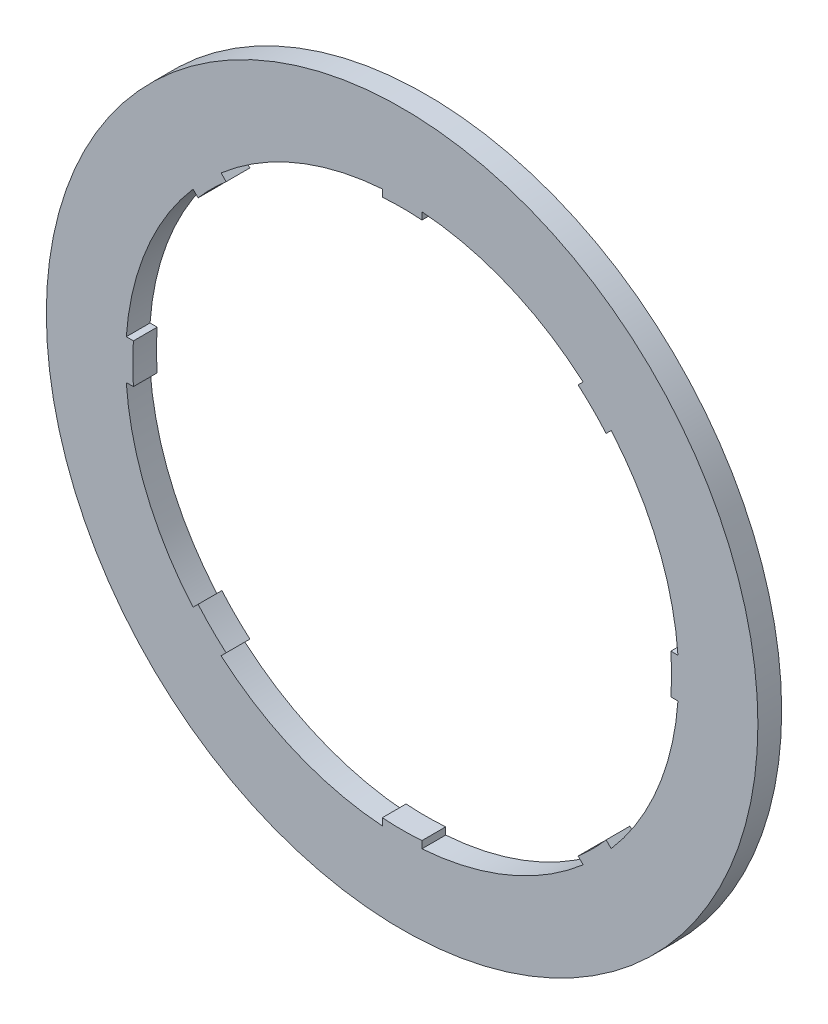
ISO-10303-21;
HEADER;
FILE_DESCRIPTION(('STEP AP214'),'2;1');
FILE_NAME('part.step','',(''),(''),'','','');
FILE_SCHEMA(('AUTOMOTIVE_DESIGN { 1 0 10303 214 1 1 1 1 }'));
ENDSEC;
DATA;
#1=APPLICATION_CONTEXT('core data for automotive mechanical design processes');
#2=APPLICATION_PROTOCOL_DEFINITION('international standard','automotive_design',2000,#1);
#3=PRODUCT_CONTEXT('',#1,'mechanical');
#4=PRODUCT('Part','Part','',(#3));
#5=PRODUCT_RELATED_PRODUCT_CATEGORY('part','',(#4));
#6=PRODUCT_DEFINITION_FORMATION('','',#4);
#7=PRODUCT_DEFINITION_CONTEXT('part definition',#1,'design');
#8=PRODUCT_DEFINITION('design','',#6,#7);
#9=PRODUCT_DEFINITION_SHAPE('','',#8);
#10=(LENGTH_UNIT() NAMED_UNIT(*) SI_UNIT(.MILLI.,.METRE.));
#11=(NAMED_UNIT(*) PLANE_ANGLE_UNIT() SI_UNIT($,.RADIAN.));
#12=(NAMED_UNIT(*) SI_UNIT($,.STERADIAN.) SOLID_ANGLE_UNIT());
#13=UNCERTAINTY_MEASURE_WITH_UNIT(LENGTH_MEASURE(1.E-05),#10,'distance_accuracy_value','');
#14=(GEOMETRIC_REPRESENTATION_CONTEXT(3) GLOBAL_UNCERTAINTY_ASSIGNED_CONTEXT((#13)) GLOBAL_UNIT_ASSIGNED_CONTEXT((#10,
#11,#12)) REPRESENTATION_CONTEXT('',''));
#15=CARTESIAN_POINT('',(0.,0.,0.));
#16=DIRECTION('',(0.,0.,1.));
#17=DIRECTION('',(1.,0.,0.));
#18=AXIS2_PLACEMENT_3D('',#15,#16,#17);
#19=CARTESIAN_POINT('',(0.,0.,3.));
#20=DIRECTION('',(0.,0.,1.));
#21=DIRECTION('',(1.,0.,0.));
#22=AXIS2_PLACEMENT_3D('',#19,#20,#21);
#23=PLANE('',#22);
#24=CARTESIAN_POINT('',(0.,0.,3.));
#25=DIRECTION('',(0.,0.,1.));
#26=DIRECTION('',(1.,0.,0.));
#27=AXIS2_PLACEMENT_3D('',#24,#25,#26);
#28=CIRCLE('',#27,44.9);
#29=CARTESIAN_POINT('',(44.9,0.,3.));
#30=VERTEX_POINT('',#29);
#31=EDGE_CURVE('E11',#30,#30,#28,.T.);
#32=ORIENTED_EDGE('',*,*,#31,.T.);
#33=EDGE_LOOP('',(#32));
#34=FACE_BOUND('',#33,.T.);
#35=DIRECTION('',(0.,1.,0.));
#36=VECTOR('',#35,1.);
#37=CARTESIAN_POINT('',(-2.5,33.9079636663719,3.));
#38=LINE('',#37,#36);
#39=CARTESIAN_POINT('',(-2.5,33.9079636663719,3.));
#40=VERTEX_POINT('',#39);
#41=CARTESIAN_POINT('',(-2.5,34.8103432904647,3.));
#42=VERTEX_POINT('',#41);
#43=EDGE_CURVE('E258',#40,#42,#38,.T.);
#44=ORIENTED_EDGE('',*,*,#43,.F.);
#45=CARTESIAN_POINT('',(0.,0.,3.));
#46=DIRECTION('',(0.,0.,1.));
#47=DIRECTION('',(1.,0.,0.));
#48=AXIS2_PLACEMENT_3D('',#45,#46,#47);
#49=CIRCLE('',#48,34.);
#50=CARTESIAN_POINT('',(2.5,33.9079636663719,3.));
#51=VERTEX_POINT('',#50);
#52=EDGE_CURVE('E250',#51,#40,#49,.T.);
#53=ORIENTED_EDGE('',*,*,#52,.F.);
#54=DIRECTION('',(0.,-1.,0.));
#55=VECTOR('',#54,1.);
#56=CARTESIAN_POINT('',(2.5,33.9079636663719,3.));
#57=LINE('',#56,#55);
#58=CARTESIAN_POINT('',(2.5,34.8103432904647,3.));
#59=VERTEX_POINT('',#58);
#60=EDGE_CURVE('E330',#59,#51,#57,.T.);
#61=ORIENTED_EDGE('',*,*,#60,.F.);
#62=CARTESIAN_POINT('',(0.,0.,3.));
#63=DIRECTION('',(0.,0.,1.));
#64=DIRECTION('',(1.,0.,0.));
#65=AXIS2_PLACEMENT_3D('',#62,#63,#64);
#66=CIRCLE('',#65,34.9);
#67=CARTESIAN_POINT('',(22.846862843153,26.3823967490855,3.));
#68=VERTEX_POINT('',#67);
#69=EDGE_CURVE('E328',#68,#59,#66,.T.);
#70=ORIENTED_EDGE('',*,*,#69,.F.);
#71=DIRECTION('',(0.707106781186551,0.707106781186544,0.));
#72=VECTOR('',#71,1.);
#73=CARTESIAN_POINT('',(22.846862843153,26.3823967490855,3.));
#74=LINE('',#73,#72);
#75=CARTESIAN_POINT('',(22.2087840917524,25.7443179976849,3.));
#76=VERTEX_POINT('',#75);
#77=EDGE_CURVE('E326',#76,#68,#74,.T.);
#78=ORIENTED_EDGE('',*,*,#77,.F.);
#79=CARTESIAN_POINT('',(0.,0.,3.));
#80=DIRECTION('',(0.,0.,1.));
#81=DIRECTION('',(1.,0.,0.));
#82=AXIS2_PLACEMENT_3D('',#79,#80,#81);
#83=CIRCLE('',#82,34.);
#84=CARTESIAN_POINT('',(25.7443179976852,22.2087840917522,3.));
#85=VERTEX_POINT('',#84);
#86=EDGE_CURVE('E324',#85,#76,#83,.T.);
#87=ORIENTED_EDGE('',*,*,#86,.F.);
#88=DIRECTION('',(-0.707106781186555,-0.70710678118654,0.));
#89=VECTOR('',#88,1.);
#90=CARTESIAN_POINT('',(26.3823967490857,22.8468628431527,3.));
#91=LINE('',#90,#89);
#92=CARTESIAN_POINT('',(26.3823967490857,22.8468628431527,3.));
#93=VERTEX_POINT('',#92);
#94=EDGE_CURVE('E322',#93,#85,#91,.T.);
#95=ORIENTED_EDGE('',*,*,#94,.F.);
#96=CARTESIAN_POINT('',(0.,0.,3.));
#97=DIRECTION('',(0.,0.,1.));
#98=DIRECTION('',(1.,0.,0.));
#99=AXIS2_PLACEMENT_3D('',#96,#97,#98);
#100=CIRCLE('',#99,34.9);
#101=CARTESIAN_POINT('',(34.8103432904647,2.50000000000001,3.));
#102=VERTEX_POINT('',#101);
#103=EDGE_CURVE('E320',#102,#93,#100,.T.);
#104=ORIENTED_EDGE('',*,*,#103,.F.);
#105=DIRECTION('',(1.,0.,0.));
#106=VECTOR('',#105,1.);
#107=CARTESIAN_POINT('',(34.8103432904647,2.50000000000001,3.));
#108=LINE('',#107,#106);
#109=CARTESIAN_POINT('',(33.907963666372,2.50000000000002,3.));
#110=VERTEX_POINT('',#109);
#111=EDGE_CURVE('E318',#110,#102,#108,.T.);
#112=ORIENTED_EDGE('',*,*,#111,.F.);
#113=CARTESIAN_POINT('',(0.,0.,3.));
#114=DIRECTION('',(0.,0.,1.));
#115=DIRECTION('',(1.,0.,0.));
#116=AXIS2_PLACEMENT_3D('',#113,#114,#115);
#117=CIRCLE('',#116,34.);
#118=CARTESIAN_POINT('',(33.907963666372,-2.49999999999999,3.));
#119=VERTEX_POINT('',#118);
#120=EDGE_CURVE('E316',#119,#110,#117,.T.);
#121=ORIENTED_EDGE('',*,*,#120,.F.);
#122=DIRECTION('',(-1.,0.,0.));
#123=VECTOR('',#122,1.);
#124=CARTESIAN_POINT('',(33.907963666372,-2.49999999999999,3.));
#125=LINE('',#124,#123);
#126=CARTESIAN_POINT('',(34.8103432904647,-2.5,3.));
#127=VERTEX_POINT('',#126);
#128=EDGE_CURVE('E314',#127,#119,#125,.T.);
#129=ORIENTED_EDGE('',*,*,#128,.F.);
#130=CARTESIAN_POINT('',(0.,0.,3.));
#131=DIRECTION('',(0.,0.,1.));
#132=DIRECTION('',(1.,0.,0.));
#133=AXIS2_PLACEMENT_3D('',#130,#131,#132);
#134=CIRCLE('',#133,34.9);
#135=CARTESIAN_POINT('',(26.3823967490852,-22.8468628431533,3.));
#136=VERTEX_POINT('',#135);
#137=EDGE_CURVE('E312',#136,#127,#134,.T.);
#138=ORIENTED_EDGE('',*,*,#137,.F.);
#139=DIRECTION('',(0.707106781186536,-0.707106781186559,0.));
#140=VECTOR('',#139,1.);
#141=CARTESIAN_POINT('',(26.3823967490852,-22.8468628431533,3.));
#142=LINE('',#141,#140);
#143=CARTESIAN_POINT('',(25.7443179976847,-22.2087840917527,3.));
#144=VERTEX_POINT('',#143);
#145=EDGE_CURVE('E310',#144,#136,#142,.T.);
#146=ORIENTED_EDGE('',*,*,#145,.F.);
#147=CARTESIAN_POINT('',(0.,0.,3.));
#148=DIRECTION('',(0.,0.,1.));
#149=DIRECTION('',(1.,0.,0.));
#150=AXIS2_PLACEMENT_3D('',#147,#148,#149);
#151=CIRCLE('',#150,34.);
#152=CARTESIAN_POINT('',(22.2087840917519,-25.7443179976854,3.));
#153=VERTEX_POINT('',#152);
#154=EDGE_CURVE('E308',#153,#144,#151,.T.);
#155=ORIENTED_EDGE('',*,*,#154,.F.);
#156=DIRECTION('',(-0.707106781186538,0.707106781186557,0.));
#157=VECTOR('',#156,1.);
#158=CARTESIAN_POINT('',(22.8468628431524,-26.3823967490859,3.));
#159=LINE('',#158,#157);
#160=CARTESIAN_POINT('',(22.8468628431524,-26.382396749086,3.));
#161=VERTEX_POINT('',#160);
#162=EDGE_CURVE('E306',#161,#153,#159,.T.);
#163=ORIENTED_EDGE('',*,*,#162,.F.);
#164=CARTESIAN_POINT('',(0.,0.,3.));
#165=DIRECTION('',(0.,0.,1.));
#166=DIRECTION('',(1.,0.,0.));
#167=AXIS2_PLACEMENT_3D('',#164,#165,#166);
#168=CIRCLE('',#167,34.9);
#169=CARTESIAN_POINT('',(2.5,-34.8103432904647,3.));
#170=VERTEX_POINT('',#169);
#171=EDGE_CURVE('E304',#170,#161,#168,.T.);
#172=ORIENTED_EDGE('',*,*,#171,.F.);
#173=DIRECTION('',(0.,-1.,0.));
#174=VECTOR('',#173,1.);
#175=CARTESIAN_POINT('',(2.5,-33.9079636663719,3.));
#176=LINE('',#175,#174);
#177=CARTESIAN_POINT('',(2.50000000000001,-33.9079636663719,3.));
#178=VERTEX_POINT('',#177);
#179=EDGE_CURVE('E302',#178,#170,#176,.T.);
#180=ORIENTED_EDGE('',*,*,#179,.F.);
#181=CARTESIAN_POINT('',(0.,0.,3.));
#182=DIRECTION('',(0.,0.,1.));
#183=DIRECTION('',(1.,0.,0.));
#184=AXIS2_PLACEMENT_3D('',#181,#182,#183);
#185=CIRCLE('',#184,34.);
#186=CARTESIAN_POINT('',(-2.5,-33.9079636663719,3.));
#187=VERTEX_POINT('',#186);
#188=EDGE_CURVE('E300',#187,#178,#185,.T.);
#189=ORIENTED_EDGE('',*,*,#188,.F.);
#190=DIRECTION('',(0.,1.,0.));
#191=VECTOR('',#190,1.);
#192=CARTESIAN_POINT('',(-2.5,-33.9079636663719,3.));
#193=LINE('',#192,#191);
#194=CARTESIAN_POINT('',(-2.5,-34.8103432904647,3.));
#195=VERTEX_POINT('',#194);
#196=EDGE_CURVE('E298',#195,#187,#193,.T.);
#197=ORIENTED_EDGE('',*,*,#196,.F.);
#198=CARTESIAN_POINT('',(0.,0.,3.));
#199=DIRECTION('',(0.,0.,1.));
#200=DIRECTION('',(1.,0.,0.));
#201=AXIS2_PLACEMENT_3D('',#198,#199,#200);
#202=CIRCLE('',#201,34.9);
#203=CARTESIAN_POINT('',(-22.8468628431524,-26.382396749086,3.));
#204=VERTEX_POINT('',#203);
#205=EDGE_CURVE('E296',#204,#195,#202,.T.);
#206=ORIENTED_EDGE('',*,*,#205,.F.);
#207=DIRECTION('',(-0.707106781186532,-0.707106781186563,0.));
#208=VECTOR('',#207,1.);
#209=CARTESIAN_POINT('',(-22.8468628431524,-26.382396749086,3.));
#210=LINE('',#209,#208);
#211=CARTESIAN_POINT('',(-22.2087840917519,-25.7443179976854,3.));
#212=VERTEX_POINT('',#211);
#213=EDGE_CURVE('E294',#212,#204,#210,.T.);
#214=ORIENTED_EDGE('',*,*,#213,.F.);
#215=CARTESIAN_POINT('',(0.,0.,3.));
#216=DIRECTION('',(0.,0.,1.));
#217=DIRECTION('',(1.,0.,0.));
#218=AXIS2_PLACEMENT_3D('',#215,#216,#217);
#219=CIRCLE('',#218,34.);
#220=CARTESIAN_POINT('',(-25.7443179976847,-22.2087840917527,3.));
#221=VERTEX_POINT('',#220);
#222=EDGE_CURVE('E292',#221,#212,#219,.T.);
#223=ORIENTED_EDGE('',*,*,#222,.F.);
#224=DIRECTION('',(0.707106781186536,0.707106781186559,0.));
#225=VECTOR('',#224,1.);
#226=CARTESIAN_POINT('',(-26.3823967490852,-22.8468628431533,3.));
#227=LINE('',#226,#225);
#228=CARTESIAN_POINT('',(-26.3823967490852,-22.8468628431533,3.));
#229=VERTEX_POINT('',#228);
#230=EDGE_CURVE('E290',#229,#221,#227,.T.);
#231=ORIENTED_EDGE('',*,*,#230,.F.);
#232=CARTESIAN_POINT('',(0.,0.,3.));
#233=DIRECTION('',(0.,0.,1.));
#234=DIRECTION('',(1.,0.,0.));
#235=AXIS2_PLACEMENT_3D('',#232,#233,#234);
#236=CIRCLE('',#235,34.9);
#237=CARTESIAN_POINT('',(-34.8103432904647,-2.5,3.));
#238=VERTEX_POINT('',#237);
#239=EDGE_CURVE('E288',#238,#229,#236,.T.);
#240=ORIENTED_EDGE('',*,*,#239,.F.);
#241=DIRECTION('',(-1.,0.,0.));
#242=VECTOR('',#241,1.);
#243=CARTESIAN_POINT('',(-33.9079636663719,-2.5,3.));
#244=LINE('',#243,#242);
#245=CARTESIAN_POINT('',(-33.9079636663719,-2.5,3.));
#246=VERTEX_POINT('',#245);
#247=EDGE_CURVE('E286',#246,#238,#244,.T.);
#248=ORIENTED_EDGE('',*,*,#247,.F.);
#249=CARTESIAN_POINT('',(0.,0.,3.));
#250=DIRECTION('',(0.,0.,1.));
#251=DIRECTION('',(1.,0.,0.));
#252=AXIS2_PLACEMENT_3D('',#249,#250,#251);
#253=CIRCLE('',#252,34.);
#254=CARTESIAN_POINT('',(-33.9079636663719,2.5,3.));
#255=VERTEX_POINT('',#254);
#256=EDGE_CURVE('E284',#255,#246,#253,.T.);
#257=ORIENTED_EDGE('',*,*,#256,.F.);
#258=DIRECTION('',(1.,0.,0.));
#259=VECTOR('',#258,1.);
#260=CARTESIAN_POINT('',(-34.8103432904647,2.5,3.));
#261=LINE('',#260,#259);
#262=CARTESIAN_POINT('',(-34.8103432904647,2.49999999999999,3.));
#263=VERTEX_POINT('',#262);
#264=EDGE_CURVE('E282',#263,#255,#261,.T.);
#265=ORIENTED_EDGE('',*,*,#264,.F.);
#266=CARTESIAN_POINT('',(0.,0.,3.));
#267=DIRECTION('',(0.,0.,1.));
#268=DIRECTION('',(1.,0.,0.));
#269=AXIS2_PLACEMENT_3D('',#266,#267,#268);
#270=CIRCLE('',#269,34.9);
#271=CARTESIAN_POINT('',(-26.3823967490857,22.8468628431527,3.));
#272=VERTEX_POINT('',#271);
#273=EDGE_CURVE('E280',#272,#263,#270,.T.);
#274=ORIENTED_EDGE('',*,*,#273,.F.);
#275=DIRECTION('',(-0.707106781186553,0.707106781186542,0.));
#276=VECTOR('',#275,1.);
#277=CARTESIAN_POINT('',(-26.3823967490857,22.8468628431527,3.));
#278=LINE('',#277,#276);
#279=CARTESIAN_POINT('',(-25.7443179976852,22.2087840917522,3.));
#280=VERTEX_POINT('',#279);
#281=EDGE_CURVE('E278',#280,#272,#278,.T.);
#282=ORIENTED_EDGE('',*,*,#281,.F.);
#283=CARTESIAN_POINT('',(0.,0.,3.));
#284=DIRECTION('',(0.,0.,1.));
#285=DIRECTION('',(1.,0.,0.));
#286=AXIS2_PLACEMENT_3D('',#283,#284,#285);
#287=CIRCLE('',#286,34.);
#288=CARTESIAN_POINT('',(-22.2087840917524,25.7443179976849,3.));
#289=VERTEX_POINT('',#288);
#290=EDGE_CURVE('E276',#289,#280,#287,.T.);
#291=ORIENTED_EDGE('',*,*,#290,.F.);
#292=DIRECTION('',(0.707106781186551,-0.707106781186544,0.));
#293=VECTOR('',#292,1.);
#294=CARTESIAN_POINT('',(-22.846862843153,26.3823967490855,3.));
#295=LINE('',#294,#293);
#296=CARTESIAN_POINT('',(-22.846862843153,26.3823967490855,3.));
#297=VERTEX_POINT('',#296);
#298=EDGE_CURVE('E272',#297,#289,#295,.T.);
#299=ORIENTED_EDGE('',*,*,#298,.F.);
#300=CARTESIAN_POINT('',(0.,0.,3.));
#301=DIRECTION('',(0.,0.,1.));
#302=DIRECTION('',(1.,0.,0.));
#303=AXIS2_PLACEMENT_3D('',#300,#301,#302);
#304=CIRCLE('',#303,34.9);
#305=EDGE_CURVE('E270',#42,#297,#304,.T.);
#306=ORIENTED_EDGE('',*,*,#305,.F.);
#307=EDGE_LOOP('',(#44,#53,#61,#70,#78,#87,#95,#104,#112,#121,#129,#138,#146,#155,#163,#172,
#180,#189,#197,#206,#214,#223,#231,#240,#248,#257,#265,#274,#282,#291,#299,#306));
#308=FACE_BOUND('',#307,.T.);
#309=ADVANCED_FACE('F41',(#34,#308),#23,.T.);
#310=CARTESIAN_POINT('',(0.,0.,0.));
#311=DIRECTION('',(0.,0.,1.));
#312=DIRECTION('',(1.,0.,0.));
#313=AXIS2_PLACEMENT_3D('',#310,#311,#312);
#314=PLANE('',#313);
#315=CARTESIAN_POINT('',(0.,0.,0.));
#316=DIRECTION('',(0.,0.,1.));
#317=DIRECTION('',(1.,0.,0.));
#318=AXIS2_PLACEMENT_3D('',#315,#316,#317);
#319=CIRCLE('',#318,44.9);
#320=CARTESIAN_POINT('',(44.9,0.,0.));
#321=VERTEX_POINT('',#320);
#322=EDGE_CURVE('E45',#321,#321,#319,.T.);
#323=ORIENTED_EDGE('',*,*,#322,.F.);
#324=EDGE_LOOP('',(#323));
#325=FACE_BOUND('',#324,.T.);
#326=CARTESIAN_POINT('',(0.,0.,0.));
#327=DIRECTION('',(0.,0.,1.));
#328=DIRECTION('',(1.,0.,0.));
#329=AXIS2_PLACEMENT_3D('',#326,#327,#328);
#330=CIRCLE('',#329,34.);
#331=CARTESIAN_POINT('',(2.5,33.9079636663719,0.));
#332=VERTEX_POINT('',#331);
#333=CARTESIAN_POINT('',(-2.5,33.9079636663719,0.));
#334=VERTEX_POINT('',#333);
#335=EDGE_CURVE('E64',#332,#334,#330,.T.);
#336=ORIENTED_EDGE('',*,*,#335,.T.);
#337=DIRECTION('',(0.,1.,0.));
#338=VECTOR('',#337,1.);
#339=CARTESIAN_POINT('',(-2.5,33.9079636663719,0.));
#340=LINE('',#339,#338);
#341=CARTESIAN_POINT('',(-2.5,34.8103432904647,0.));
#342=VERTEX_POINT('',#341);
#343=EDGE_CURVE('E265',#334,#342,#340,.T.);
#344=ORIENTED_EDGE('',*,*,#343,.T.);
#345=CARTESIAN_POINT('',(0.,0.,0.));
#346=DIRECTION('',(0.,0.,1.));
#347=DIRECTION('',(1.,0.,0.));
#348=AXIS2_PLACEMENT_3D('',#345,#346,#347);
#349=CIRCLE('',#348,34.9);
#350=CARTESIAN_POINT('',(-22.846862843153,26.3823967490855,0.));
#351=VERTEX_POINT('',#350);
#352=EDGE_CURVE('E334',#342,#351,#349,.T.);
#353=ORIENTED_EDGE('',*,*,#352,.T.);
#354=DIRECTION('',(0.707106781186551,-0.707106781186544,0.));
#355=VECTOR('',#354,1.);
#356=CARTESIAN_POINT('',(-22.846862843153,26.3823967490855,0.));
#357=LINE('',#356,#355);
#358=CARTESIAN_POINT('',(-22.2087840917524,25.7443179976849,0.));
#359=VERTEX_POINT('',#358);
#360=EDGE_CURVE('E337',#351,#359,#357,.T.);
#361=ORIENTED_EDGE('',*,*,#360,.T.);
#362=CARTESIAN_POINT('',(0.,0.,0.));
#363=DIRECTION('',(0.,0.,1.));
#364=DIRECTION('',(1.,0.,0.));
#365=AXIS2_PLACEMENT_3D('',#362,#363,#364);
#366=CIRCLE('',#365,34.);
#367=CARTESIAN_POINT('',(-25.7443179976852,22.2087840917522,0.));
#368=VERTEX_POINT('',#367);
#369=EDGE_CURVE('E340',#359,#368,#366,.T.);
#370=ORIENTED_EDGE('',*,*,#369,.T.);
#371=DIRECTION('',(-0.707106781186553,0.707106781186542,0.));
#372=VECTOR('',#371,1.);
#373=CARTESIAN_POINT('',(-26.3823967490857,22.8468628431527,0.));
#374=LINE('',#373,#372);
#375=CARTESIAN_POINT('',(-26.3823967490857,22.8468628431527,0.));
#376=VERTEX_POINT('',#375);
#377=EDGE_CURVE('E343',#368,#376,#374,.T.);
#378=ORIENTED_EDGE('',*,*,#377,.T.);
#379=CARTESIAN_POINT('',(0.,0.,0.));
#380=DIRECTION('',(0.,0.,1.));
#381=DIRECTION('',(1.,0.,0.));
#382=AXIS2_PLACEMENT_3D('',#379,#380,#381);
#383=CIRCLE('',#382,34.9);
#384=CARTESIAN_POINT('',(-34.8103432904647,2.49999999999999,0.));
#385=VERTEX_POINT('',#384);
#386=EDGE_CURVE('E346',#376,#385,#383,.T.);
#387=ORIENTED_EDGE('',*,*,#386,.T.);
#388=DIRECTION('',(1.,0.,0.));
#389=VECTOR('',#388,1.);
#390=CARTESIAN_POINT('',(-34.8103432904647,2.5,0.));
#391=LINE('',#390,#389);
#392=CARTESIAN_POINT('',(-33.9079636663719,2.5,0.));
#393=VERTEX_POINT('',#392);
#394=EDGE_CURVE('E349',#385,#393,#391,.T.);
#395=ORIENTED_EDGE('',*,*,#394,.T.);
#396=CARTESIAN_POINT('',(0.,0.,0.));
#397=DIRECTION('',(0.,0.,1.));
#398=DIRECTION('',(1.,0.,0.));
#399=AXIS2_PLACEMENT_3D('',#396,#397,#398);
#400=CIRCLE('',#399,34.);
#401=CARTESIAN_POINT('',(-33.9079636663719,-2.5,0.));
#402=VERTEX_POINT('',#401);
#403=EDGE_CURVE('E352',#393,#402,#400,.T.);
#404=ORIENTED_EDGE('',*,*,#403,.T.);
#405=DIRECTION('',(-1.,0.,0.));
#406=VECTOR('',#405,1.);
#407=CARTESIAN_POINT('',(-33.9079636663719,-2.5,0.));
#408=LINE('',#407,#406);
#409=CARTESIAN_POINT('',(-34.8103432904647,-2.5,0.));
#410=VERTEX_POINT('',#409);
#411=EDGE_CURVE('E355',#402,#410,#408,.T.);
#412=ORIENTED_EDGE('',*,*,#411,.T.);
#413=CARTESIAN_POINT('',(0.,0.,0.));
#414=DIRECTION('',(0.,0.,1.));
#415=DIRECTION('',(1.,0.,0.));
#416=AXIS2_PLACEMENT_3D('',#413,#414,#415);
#417=CIRCLE('',#416,34.9);
#418=CARTESIAN_POINT('',(-26.3823967490852,-22.8468628431533,0.));
#419=VERTEX_POINT('',#418);
#420=EDGE_CURVE('E358',#410,#419,#417,.T.);
#421=ORIENTED_EDGE('',*,*,#420,.T.);
#422=DIRECTION('',(0.707106781186536,0.707106781186559,0.));
#423=VECTOR('',#422,1.);
#424=CARTESIAN_POINT('',(-26.3823967490852,-22.8468628431533,0.));
#425=LINE('',#424,#423);
#426=CARTESIAN_POINT('',(-25.7443179976847,-22.2087840917527,0.));
#427=VERTEX_POINT('',#426);
#428=EDGE_CURVE('E361',#419,#427,#425,.T.);
#429=ORIENTED_EDGE('',*,*,#428,.T.);
#430=CARTESIAN_POINT('',(0.,0.,0.));
#431=DIRECTION('',(0.,0.,1.));
#432=DIRECTION('',(1.,0.,0.));
#433=AXIS2_PLACEMENT_3D('',#430,#431,#432);
#434=CIRCLE('',#433,34.);
#435=CARTESIAN_POINT('',(-22.2087840917519,-25.7443179976854,0.));
#436=VERTEX_POINT('',#435);
#437=EDGE_CURVE('E364',#427,#436,#434,.T.);
#438=ORIENTED_EDGE('',*,*,#437,.T.);
#439=DIRECTION('',(-0.707106781186532,-0.707106781186563,0.));
#440=VECTOR('',#439,1.);
#441=CARTESIAN_POINT('',(-22.8468628431524,-26.382396749086,0.));
#442=LINE('',#441,#440);
#443=CARTESIAN_POINT('',(-22.8468628431524,-26.382396749086,0.));
#444=VERTEX_POINT('',#443);
#445=EDGE_CURVE('E367',#436,#444,#442,.T.);
#446=ORIENTED_EDGE('',*,*,#445,.T.);
#447=CARTESIAN_POINT('',(0.,0.,0.));
#448=DIRECTION('',(0.,0.,1.));
#449=DIRECTION('',(1.,0.,0.));
#450=AXIS2_PLACEMENT_3D('',#447,#448,#449);
#451=CIRCLE('',#450,34.9);
#452=CARTESIAN_POINT('',(-2.5,-34.8103432904647,0.));
#453=VERTEX_POINT('',#452);
#454=EDGE_CURVE('E370',#444,#453,#451,.T.);
#455=ORIENTED_EDGE('',*,*,#454,.T.);
#456=DIRECTION('',(0.,1.,0.));
#457=VECTOR('',#456,1.);
#458=CARTESIAN_POINT('',(-2.5,-33.9079636663719,0.));
#459=LINE('',#458,#457);
#460=CARTESIAN_POINT('',(-2.5,-33.9079636663719,0.));
#461=VERTEX_POINT('',#460);
#462=EDGE_CURVE('E373',#453,#461,#459,.T.);
#463=ORIENTED_EDGE('',*,*,#462,.T.);
#464=CARTESIAN_POINT('',(0.,0.,0.));
#465=DIRECTION('',(0.,0.,1.));
#466=DIRECTION('',(1.,0.,0.));
#467=AXIS2_PLACEMENT_3D('',#464,#465,#466);
#468=CIRCLE('',#467,34.);
#469=CARTESIAN_POINT('',(2.50000000000001,-33.9079636663719,0.));
#470=VERTEX_POINT('',#469);
#471=EDGE_CURVE('E376',#461,#470,#468,.T.);
#472=ORIENTED_EDGE('',*,*,#471,.T.);
#473=DIRECTION('',(0.,-1.,0.));
#474=VECTOR('',#473,1.);
#475=CARTESIAN_POINT('',(2.5,-33.9079636663719,0.));
#476=LINE('',#475,#474);
#477=CARTESIAN_POINT('',(2.5,-34.8103432904647,0.));
#478=VERTEX_POINT('',#477);
#479=EDGE_CURVE('E379',#470,#478,#476,.T.);
#480=ORIENTED_EDGE('',*,*,#479,.T.);
#481=CARTESIAN_POINT('',(0.,0.,0.));
#482=DIRECTION('',(0.,0.,1.));
#483=DIRECTION('',(1.,0.,0.));
#484=AXIS2_PLACEMENT_3D('',#481,#482,#483);
#485=CIRCLE('',#484,34.9);
#486=CARTESIAN_POINT('',(22.8468628431524,-26.382396749086,0.));
#487=VERTEX_POINT('',#486);
#488=EDGE_CURVE('E382',#478,#487,#485,.T.);
#489=ORIENTED_EDGE('',*,*,#488,.T.);
#490=DIRECTION('',(-0.707106781186538,0.707106781186557,0.));
#491=VECTOR('',#490,1.);
#492=CARTESIAN_POINT('',(22.8468628431524,-26.3823967490859,0.));
#493=LINE('',#492,#491);
#494=CARTESIAN_POINT('',(22.2087840917519,-25.7443179976854,0.));
#495=VERTEX_POINT('',#494);
#496=EDGE_CURVE('E385',#487,#495,#493,.T.);
#497=ORIENTED_EDGE('',*,*,#496,.T.);
#498=CARTESIAN_POINT('',(0.,0.,0.));
#499=DIRECTION('',(0.,0.,1.));
#500=DIRECTION('',(1.,0.,0.));
#501=AXIS2_PLACEMENT_3D('',#498,#499,#500);
#502=CIRCLE('',#501,34.);
#503=CARTESIAN_POINT('',(25.7443179976847,-22.2087840917527,0.));
#504=VERTEX_POINT('',#503);
#505=EDGE_CURVE('E388',#495,#504,#502,.T.);
#506=ORIENTED_EDGE('',*,*,#505,.T.);
#507=DIRECTION('',(0.707106781186536,-0.707106781186559,0.));
#508=VECTOR('',#507,1.);
#509=CARTESIAN_POINT('',(26.3823967490852,-22.8468628431533,0.));
#510=LINE('',#509,#508);
#511=CARTESIAN_POINT('',(26.3823967490852,-22.8468628431533,0.));
#512=VERTEX_POINT('',#511);
#513=EDGE_CURVE('E391',#504,#512,#510,.T.);
#514=ORIENTED_EDGE('',*,*,#513,.T.);
#515=CARTESIAN_POINT('',(0.,0.,0.));
#516=DIRECTION('',(0.,0.,1.));
#517=DIRECTION('',(1.,0.,0.));
#518=AXIS2_PLACEMENT_3D('',#515,#516,#517);
#519=CIRCLE('',#518,34.9);
#520=CARTESIAN_POINT('',(34.8103432904647,-2.5,0.));
#521=VERTEX_POINT('',#520);
#522=EDGE_CURVE('E394',#512,#521,#519,.T.);
#523=ORIENTED_EDGE('',*,*,#522,.T.);
#524=DIRECTION('',(-1.,0.,0.));
#525=VECTOR('',#524,1.);
#526=CARTESIAN_POINT('',(33.907963666372,-2.49999999999999,0.));
#527=LINE('',#526,#525);
#528=CARTESIAN_POINT('',(33.907963666372,-2.49999999999999,0.));
#529=VERTEX_POINT('',#528);
#530=EDGE_CURVE('E397',#521,#529,#527,.T.);
#531=ORIENTED_EDGE('',*,*,#530,.T.);
#532=CARTESIAN_POINT('',(0.,0.,0.));
#533=DIRECTION('',(0.,0.,1.));
#534=DIRECTION('',(1.,0.,0.));
#535=AXIS2_PLACEMENT_3D('',#532,#533,#534);
#536=CIRCLE('',#535,34.);
#537=CARTESIAN_POINT('',(33.907963666372,2.50000000000002,0.));
#538=VERTEX_POINT('',#537);
#539=EDGE_CURVE('E400',#529,#538,#536,.T.);
#540=ORIENTED_EDGE('',*,*,#539,.T.);
#541=DIRECTION('',(1.,0.,0.));
#542=VECTOR('',#541,1.);
#543=CARTESIAN_POINT('',(34.8103432904647,2.50000000000001,0.));
#544=LINE('',#543,#542);
#545=CARTESIAN_POINT('',(34.8103432904647,2.50000000000001,0.));
#546=VERTEX_POINT('',#545);
#547=EDGE_CURVE('E403',#538,#546,#544,.T.);
#548=ORIENTED_EDGE('',*,*,#547,.T.);
#549=CARTESIAN_POINT('',(0.,0.,0.));
#550=DIRECTION('',(0.,0.,1.));
#551=DIRECTION('',(1.,0.,0.));
#552=AXIS2_PLACEMENT_3D('',#549,#550,#551);
#553=CIRCLE('',#552,34.9);
#554=CARTESIAN_POINT('',(26.3823967490857,22.8468628431527,0.));
#555=VERTEX_POINT('',#554);
#556=EDGE_CURVE('E406',#546,#555,#553,.T.);
#557=ORIENTED_EDGE('',*,*,#556,.T.);
#558=DIRECTION('',(-0.707106781186555,-0.70710678118654,0.));
#559=VECTOR('',#558,1.);
#560=CARTESIAN_POINT('',(26.3823967490857,22.8468628431527,0.));
#561=LINE('',#560,#559);
#562=CARTESIAN_POINT('',(25.7443179976852,22.2087840917522,0.));
#563=VERTEX_POINT('',#562);
#564=EDGE_CURVE('E409',#555,#563,#561,.T.);
#565=ORIENTED_EDGE('',*,*,#564,.T.);
#566=CARTESIAN_POINT('',(0.,0.,0.));
#567=DIRECTION('',(0.,0.,1.));
#568=DIRECTION('',(1.,0.,0.));
#569=AXIS2_PLACEMENT_3D('',#566,#567,#568);
#570=CIRCLE('',#569,34.);
#571=CARTESIAN_POINT('',(22.2087840917524,25.7443179976849,0.));
#572=VERTEX_POINT('',#571);
#573=EDGE_CURVE('E412',#563,#572,#570,.T.);
#574=ORIENTED_EDGE('',*,*,#573,.T.);
#575=DIRECTION('',(0.707106781186551,0.707106781186544,0.));
#576=VECTOR('',#575,1.);
#577=CARTESIAN_POINT('',(22.846862843153,26.3823967490855,0.));
#578=LINE('',#577,#576);
#579=CARTESIAN_POINT('',(22.846862843153,26.3823967490855,0.));
#580=VERTEX_POINT('',#579);
#581=EDGE_CURVE('E415',#572,#580,#578,.T.);
#582=ORIENTED_EDGE('',*,*,#581,.T.);
#583=CARTESIAN_POINT('',(0.,0.,0.));
#584=DIRECTION('',(0.,0.,1.));
#585=DIRECTION('',(1.,0.,0.));
#586=AXIS2_PLACEMENT_3D('',#583,#584,#585);
#587=CIRCLE('',#586,34.9);
#588=CARTESIAN_POINT('',(2.5,34.8103432904647,0.));
#589=VERTEX_POINT('',#588);
#590=EDGE_CURVE('E418',#580,#589,#587,.T.);
#591=ORIENTED_EDGE('',*,*,#590,.T.);
#592=DIRECTION('',(0.,-1.,0.));
#593=VECTOR('',#592,1.);
#594=CARTESIAN_POINT('',(2.5,33.9079636663719,0.));
#595=LINE('',#594,#593);
#596=EDGE_CURVE('E259',#589,#332,#595,.T.);
#597=ORIENTED_EDGE('',*,*,#596,.T.);
#598=EDGE_LOOP('',(#336,#344,#353,#361,#370,#378,#387,#395,#404,#412,#421,#429,#438,#446,#455,
#463,#472,#480,#489,#497,#506,#514,#523,#531,#540,#548,#557,#565,#574,#582,#591,#597));
#599=FACE_BOUND('',#598,.T.);
#600=ADVANCED_FACE('F487',(#325,#599),#314,.F.);
#601=CARTESIAN_POINT('',(0.,0.,3.));
#602=DIRECTION('',(0.,0.,-1.));
#603=DIRECTION('',(-1.,0.,0.));
#604=AXIS2_PLACEMENT_3D('',#601,#602,#603);
#605=CYLINDRICAL_SURFACE('',#604,44.9);
#606=ORIENTED_EDGE('',*,*,#31,.F.);
#607=EDGE_LOOP('',(#606));
#608=FACE_BOUND('',#607,.T.);
#609=ORIENTED_EDGE('',*,*,#322,.T.);
#610=EDGE_LOOP('',(#609));
#611=FACE_BOUND('',#610,.T.);
#612=ADVANCED_FACE('F43',(#608,#611),#605,.T.);
#613=CARTESIAN_POINT('',(0.,0.,3.));
#614=DIRECTION('',(0.,0.,-1.));
#615=DIRECTION('',(-1.,0.,0.));
#616=AXIS2_PLACEMENT_3D('',#613,#614,#615);
#617=CYLINDRICAL_SURFACE('',#616,34.);
#618=ORIENTED_EDGE('',*,*,#335,.F.);
#619=DIRECTION('',(0.,0.,-1.));
#620=VECTOR('',#619,1.);
#621=CARTESIAN_POINT('',(2.5,33.9079636663719,3.));
#622=LINE('',#621,#620);
#623=EDGE_CURVE('E254',#51,#332,#622,.T.);
#624=ORIENTED_EDGE('',*,*,#623,.F.);
#625=ORIENTED_EDGE('',*,*,#52,.T.);
#626=DIRECTION('',(0.,0.,-1.));
#627=VECTOR('',#626,1.);
#628=CARTESIAN_POINT('',(-2.5,33.9079636663719,3.));
#629=LINE('',#628,#627);
#630=EDGE_CURVE('E253',#40,#334,#629,.T.);
#631=ORIENTED_EDGE('',*,*,#630,.T.);
#632=EDGE_LOOP('',(#618,#624,#625,#631));
#633=FACE_BOUND('',#632,.T.);
#634=ADVANCED_FACE('F252',(#633),#617,.F.);
#635=CARTESIAN_POINT('',(-2.5,33.9079636663719,3.));
#636=DIRECTION('',(-1.,0.,0.));
#637=DIRECTION('',(0.,0.,1.));
#638=AXIS2_PLACEMENT_3D('',#635,#636,#637);
#639=PLANE('',#638);
#640=ORIENTED_EDGE('',*,*,#343,.F.);
#641=ORIENTED_EDGE('',*,*,#630,.F.);
#642=ORIENTED_EDGE('',*,*,#43,.T.);
#643=DIRECTION('',(0.,0.,-1.));
#644=VECTOR('',#643,1.);
#645=CARTESIAN_POINT('',(-2.5,34.8103432904647,3.));
#646=LINE('',#645,#644);
#647=EDGE_CURVE('E266',#42,#342,#646,.T.);
#648=ORIENTED_EDGE('',*,*,#647,.T.);
#649=EDGE_LOOP('',(#640,#641,#642,#648));
#650=FACE_BOUND('',#649,.T.);
#651=ADVANCED_FACE('F262',(#650),#639,.T.);
#652=CARTESIAN_POINT('',(0.,0.,3.));
#653=DIRECTION('',(0.,0.,-1.));
#654=DIRECTION('',(-1.,0.,0.));
#655=AXIS2_PLACEMENT_3D('',#652,#653,#654);
#656=CYLINDRICAL_SURFACE('',#655,34.9);
#657=ORIENTED_EDGE('',*,*,#352,.F.);
#658=ORIENTED_EDGE('',*,*,#647,.F.);
#659=ORIENTED_EDGE('',*,*,#305,.T.);
#660=DIRECTION('',(0.,0.,-1.));
#661=VECTOR('',#660,1.);
#662=CARTESIAN_POINT('',(-22.846862843153,26.3823967490855,3.));
#663=LINE('',#662,#661);
#664=EDGE_CURVE('E479',#297,#351,#663,.T.);
#665=ORIENTED_EDGE('',*,*,#664,.T.);
#666=EDGE_LOOP('',(#657,#658,#659,#665));
#667=FACE_BOUND('',#666,.T.);
#668=ADVANCED_FACE('F483',(#667),#656,.F.);
#669=CARTESIAN_POINT('',(-22.846862843153,26.3823967490855,3.));
#670=DIRECTION('',(0.707106781186544,0.707106781186551,0.));
#671=DIRECTION('',(-0.707106781186551,0.707106781186544,0.));
#672=AXIS2_PLACEMENT_3D('',#669,#670,#671);
#673=PLANE('',#672);
#674=ORIENTED_EDGE('',*,*,#360,.F.);
#675=ORIENTED_EDGE('',*,*,#664,.F.);
#676=ORIENTED_EDGE('',*,*,#298,.T.);
#677=DIRECTION('',(0.,0.,-1.));
#678=VECTOR('',#677,1.);
#679=CARTESIAN_POINT('',(-22.2087840917524,25.7443179976849,3.));
#680=LINE('',#679,#678);
#681=EDGE_CURVE('E477',#289,#359,#680,.T.);
#682=ORIENTED_EDGE('',*,*,#681,.T.);
#683=EDGE_LOOP('',(#674,#675,#676,#682));
#684=FACE_BOUND('',#683,.T.);
#685=ADVANCED_FACE('F625',(#684),#673,.T.);
#686=CARTESIAN_POINT('',(0.,0.,3.));
#687=DIRECTION('',(0.,0.,-1.));
#688=DIRECTION('',(-1.,0.,0.));
#689=AXIS2_PLACEMENT_3D('',#686,#687,#688);
#690=CYLINDRICAL_SURFACE('',#689,34.);
#691=ORIENTED_EDGE('',*,*,#369,.F.);
#692=ORIENTED_EDGE('',*,*,#681,.F.);
#693=ORIENTED_EDGE('',*,*,#290,.T.);
#694=DIRECTION('',(0.,0.,-1.));
#695=VECTOR('',#694,1.);
#696=CARTESIAN_POINT('',(-25.7443179976852,22.2087840917522,3.));
#697=LINE('',#696,#695);
#698=EDGE_CURVE('E475',#280,#368,#697,.T.);
#699=ORIENTED_EDGE('',*,*,#698,.T.);
#700=EDGE_LOOP('',(#691,#692,#693,#699));
#701=FACE_BOUND('',#700,.T.);
#702=ADVANCED_FACE('F622',(#701),#690,.F.);
#703=CARTESIAN_POINT('',(-26.3823967490857,22.8468628431527,3.));
#704=DIRECTION('',(-0.707106781186542,-0.707106781186553,0.));
#705=DIRECTION('',(0.707106781186553,-0.707106781186542,0.));
#706=AXIS2_PLACEMENT_3D('',#703,#704,#705);
#707=PLANE('',#706);
#708=ORIENTED_EDGE('',*,*,#377,.F.);
#709=ORIENTED_EDGE('',*,*,#698,.F.);
#710=ORIENTED_EDGE('',*,*,#281,.T.);
#711=DIRECTION('',(0.,0.,-1.));
#712=VECTOR('',#711,1.);
#713=CARTESIAN_POINT('',(-26.3823967490857,22.8468628431527,3.));
#714=LINE('',#713,#712);
#715=EDGE_CURVE('E473',#272,#376,#714,.T.);
#716=ORIENTED_EDGE('',*,*,#715,.T.);
#717=EDGE_LOOP('',(#708,#709,#710,#716));
#718=FACE_BOUND('',#717,.T.);
#719=ADVANCED_FACE('F618',(#718),#707,.T.);
#720=CARTESIAN_POINT('',(0.,0.,3.));
#721=DIRECTION('',(0.,0.,-1.));
#722=DIRECTION('',(-1.,0.,0.));
#723=AXIS2_PLACEMENT_3D('',#720,#721,#722);
#724=CYLINDRICAL_SURFACE('',#723,34.9);
#725=ORIENTED_EDGE('',*,*,#386,.F.);
#726=ORIENTED_EDGE('',*,*,#715,.F.);
#727=ORIENTED_EDGE('',*,*,#273,.T.);
#728=DIRECTION('',(0.,0.,-1.));
#729=VECTOR('',#728,1.);
#730=CARTESIAN_POINT('',(-34.8103432904647,2.49999999999999,3.));
#731=LINE('',#730,#729);
#732=EDGE_CURVE('E471',#263,#385,#731,.T.);
#733=ORIENTED_EDGE('',*,*,#732,.T.);
#734=EDGE_LOOP('',(#725,#726,#727,#733));
#735=FACE_BOUND('',#734,.T.);
#736=ADVANCED_FACE('F615',(#735),#724,.F.);
#737=CARTESIAN_POINT('',(-34.8103432904647,2.5,3.));
#738=DIRECTION('',(0.,1.,0.));
#739=DIRECTION('',(-1.,0.,0.));
#740=AXIS2_PLACEMENT_3D('',#737,#738,#739);
#741=PLANE('',#740);
#742=ORIENTED_EDGE('',*,*,#394,.F.);
#743=ORIENTED_EDGE('',*,*,#732,.F.);
#744=ORIENTED_EDGE('',*,*,#264,.T.);
#745=DIRECTION('',(0.,0.,-1.));
#746=VECTOR('',#745,1.);
#747=CARTESIAN_POINT('',(-33.9079636663719,2.5,3.));
#748=LINE('',#747,#746);
#749=EDGE_CURVE('E469',#255,#393,#748,.T.);
#750=ORIENTED_EDGE('',*,*,#749,.T.);
#751=EDGE_LOOP('',(#742,#743,#744,#750));
#752=FACE_BOUND('',#751,.T.);
#753=ADVANCED_FACE('F607',(#752),#741,.T.);
#754=CARTESIAN_POINT('',(0.,0.,3.));
#755=DIRECTION('',(0.,0.,-1.));
#756=DIRECTION('',(-1.,0.,0.));
#757=AXIS2_PLACEMENT_3D('',#754,#755,#756);
#758=CYLINDRICAL_SURFACE('',#757,34.);
#759=ORIENTED_EDGE('',*,*,#403,.F.);
#760=ORIENTED_EDGE('',*,*,#749,.F.);
#761=ORIENTED_EDGE('',*,*,#256,.T.);
#762=DIRECTION('',(0.,0.,-1.));
#763=VECTOR('',#762,1.);
#764=CARTESIAN_POINT('',(-33.9079636663719,-2.5,3.));
#765=LINE('',#764,#763);
#766=EDGE_CURVE('E467',#246,#402,#765,.T.);
#767=ORIENTED_EDGE('',*,*,#766,.T.);
#768=EDGE_LOOP('',(#759,#760,#761,#767));
#769=FACE_BOUND('',#768,.T.);
#770=ADVANCED_FACE('F603',(#769),#758,.F.);
#771=CARTESIAN_POINT('',(-33.9079636663719,-2.5,3.));
#772=DIRECTION('',(0.,-1.,0.));
#773=DIRECTION('',(0.,0.,-1.));
#774=AXIS2_PLACEMENT_3D('',#771,#772,#773);
#775=PLANE('',#774);
#776=ORIENTED_EDGE('',*,*,#411,.F.);
#777=ORIENTED_EDGE('',*,*,#766,.F.);
#778=ORIENTED_EDGE('',*,*,#247,.T.);
#779=DIRECTION('',(0.,0.,-1.));
#780=VECTOR('',#779,1.);
#781=CARTESIAN_POINT('',(-34.8103432904647,-2.5,3.));
#782=LINE('',#781,#780);
#783=EDGE_CURVE('E465',#238,#410,#782,.T.);
#784=ORIENTED_EDGE('',*,*,#783,.T.);
#785=EDGE_LOOP('',(#776,#777,#778,#784));
#786=FACE_BOUND('',#785,.T.);
#787=ADVANCED_FACE('F600',(#786),#775,.T.);
#788=CARTESIAN_POINT('',(0.,0.,3.));
#789=DIRECTION('',(0.,0.,-1.));
#790=DIRECTION('',(-1.,0.,0.));
#791=AXIS2_PLACEMENT_3D('',#788,#789,#790);
#792=CYLINDRICAL_SURFACE('',#791,34.9);
#793=ORIENTED_EDGE('',*,*,#420,.F.);
#794=ORIENTED_EDGE('',*,*,#783,.F.);
#795=ORIENTED_EDGE('',*,*,#239,.T.);
#796=DIRECTION('',(0.,0.,-1.));
#797=VECTOR('',#796,1.);
#798=CARTESIAN_POINT('',(-26.3823967490852,-22.8468628431533,3.));
#799=LINE('',#798,#797);
#800=EDGE_CURVE('E463',#229,#419,#799,.T.);
#801=ORIENTED_EDGE('',*,*,#800,.T.);
#802=EDGE_LOOP('',(#793,#794,#795,#801));
#803=FACE_BOUND('',#802,.T.);
#804=ADVANCED_FACE('F592',(#803),#792,.F.);
#805=CARTESIAN_POINT('',(-26.3823967490852,-22.8468628431533,3.));
#806=DIRECTION('',(-0.707106781186559,0.707106781186536,0.));
#807=DIRECTION('',(-0.707106781186536,-0.707106781186559,0.));
#808=AXIS2_PLACEMENT_3D('',#805,#806,#807);
#809=PLANE('',#808);
#810=ORIENTED_EDGE('',*,*,#428,.F.);
#811=ORIENTED_EDGE('',*,*,#800,.F.);
#812=ORIENTED_EDGE('',*,*,#230,.T.);
#813=DIRECTION('',(0.,0.,-1.));
#814=VECTOR('',#813,1.);
#815=CARTESIAN_POINT('',(-25.7443179976847,-22.2087840917527,3.));
#816=LINE('',#815,#814);
#817=EDGE_CURVE('E461',#221,#427,#816,.T.);
#818=ORIENTED_EDGE('',*,*,#817,.T.);
#819=EDGE_LOOP('',(#810,#811,#812,#818));
#820=FACE_BOUND('',#819,.T.);
#821=ADVANCED_FACE('F588',(#820),#809,.T.);
#822=CARTESIAN_POINT('',(0.,0.,3.));
#823=DIRECTION('',(0.,0.,-1.));
#824=DIRECTION('',(-1.,0.,0.));
#825=AXIS2_PLACEMENT_3D('',#822,#823,#824);
#826=CYLINDRICAL_SURFACE('',#825,34.);
#827=ORIENTED_EDGE('',*,*,#437,.F.);
#828=ORIENTED_EDGE('',*,*,#817,.F.);
#829=ORIENTED_EDGE('',*,*,#222,.T.);
#830=DIRECTION('',(0.,0.,-1.));
#831=VECTOR('',#830,1.);
#832=CARTESIAN_POINT('',(-22.2087840917519,-25.7443179976854,3.));
#833=LINE('',#832,#831);
#834=EDGE_CURVE('E459',#212,#436,#833,.T.);
#835=ORIENTED_EDGE('',*,*,#834,.T.);
#836=EDGE_LOOP('',(#827,#828,#829,#835));
#837=FACE_BOUND('',#836,.T.);
#838=ADVANCED_FACE('F585',(#837),#826,.F.);
#839=CARTESIAN_POINT('',(-22.8468628431524,-26.382396749086,3.));
#840=DIRECTION('',(0.707106781186563,-0.707106781186532,0.));
#841=DIRECTION('',(0.707106781186532,0.707106781186563,0.));
#842=AXIS2_PLACEMENT_3D('',#839,#840,#841);
#843=PLANE('',#842);
#844=ORIENTED_EDGE('',*,*,#445,.F.);
#845=ORIENTED_EDGE('',*,*,#834,.F.);
#846=ORIENTED_EDGE('',*,*,#213,.T.);
#847=DIRECTION('',(0.,0.,-1.));
#848=VECTOR('',#847,1.);
#849=CARTESIAN_POINT('',(-22.8468628431524,-26.382396749086,3.));
#850=LINE('',#849,#848);
#851=EDGE_CURVE('E457',#204,#444,#850,.T.);
#852=ORIENTED_EDGE('',*,*,#851,.T.);
#853=EDGE_LOOP('',(#844,#845,#846,#852));
#854=FACE_BOUND('',#853,.T.);
#855=ADVANCED_FACE('F577',(#854),#843,.T.);
#856=CARTESIAN_POINT('',(0.,0.,3.));
#857=DIRECTION('',(0.,0.,-1.));
#858=DIRECTION('',(-1.,0.,0.));
#859=AXIS2_PLACEMENT_3D('',#856,#857,#858);
#860=CYLINDRICAL_SURFACE('',#859,34.9);
#861=ORIENTED_EDGE('',*,*,#454,.F.);
#862=ORIENTED_EDGE('',*,*,#851,.F.);
#863=ORIENTED_EDGE('',*,*,#205,.T.);
#864=DIRECTION('',(0.,0.,-1.));
#865=VECTOR('',#864,1.);
#866=CARTESIAN_POINT('',(-2.5,-34.8103432904647,3.));
#867=LINE('',#866,#865);
#868=EDGE_CURVE('E455',#195,#453,#867,.T.);
#869=ORIENTED_EDGE('',*,*,#868,.T.);
#870=EDGE_LOOP('',(#861,#862,#863,#869));
#871=FACE_BOUND('',#870,.T.);
#872=ADVANCED_FACE('F573',(#871),#860,.F.);
#873=CARTESIAN_POINT('',(-2.5,-33.9079636663719,3.));
#874=DIRECTION('',(-1.,0.,0.));
#875=DIRECTION('',(0.,0.,1.));
#876=AXIS2_PLACEMENT_3D('',#873,#874,#875);
#877=PLANE('',#876);
#878=ORIENTED_EDGE('',*,*,#462,.F.);
#879=ORIENTED_EDGE('',*,*,#868,.F.);
#880=ORIENTED_EDGE('',*,*,#196,.T.);
#881=DIRECTION('',(0.,0.,-1.));
#882=VECTOR('',#881,1.);
#883=CARTESIAN_POINT('',(-2.5,-33.9079636663719,3.));
#884=LINE('',#883,#882);
#885=EDGE_CURVE('E453',#187,#461,#884,.T.);
#886=ORIENTED_EDGE('',*,*,#885,.T.);
#887=EDGE_LOOP('',(#878,#879,#880,#886));
#888=FACE_BOUND('',#887,.T.);
#889=ADVANCED_FACE('F570',(#888),#877,.T.);
#890=CARTESIAN_POINT('',(0.,0.,3.));
#891=DIRECTION('',(0.,0.,-1.));
#892=DIRECTION('',(-1.,0.,0.));
#893=AXIS2_PLACEMENT_3D('',#890,#891,#892);
#894=CYLINDRICAL_SURFACE('',#893,34.);
#895=ORIENTED_EDGE('',*,*,#471,.F.);
#896=ORIENTED_EDGE('',*,*,#885,.F.);
#897=ORIENTED_EDGE('',*,*,#188,.T.);
#898=DIRECTION('',(0.,0.,-1.));
#899=VECTOR('',#898,1.);
#900=CARTESIAN_POINT('',(2.50000000000001,-33.9079636663719,3.));
#901=LINE('',#900,#899);
#902=EDGE_CURVE('E451',#178,#470,#901,.T.);
#903=ORIENTED_EDGE('',*,*,#902,.T.);
#904=EDGE_LOOP('',(#895,#896,#897,#903));
#905=FACE_BOUND('',#904,.T.);
#906=ADVANCED_FACE('F562',(#905),#894,.F.);
#907=CARTESIAN_POINT('',(2.5,-33.9079636663719,3.));
#908=DIRECTION('',(1.,0.,0.));
#909=DIRECTION('',(0.,0.,-1.));
#910=AXIS2_PLACEMENT_3D('',#907,#908,#909);
#911=PLANE('',#910);
#912=ORIENTED_EDGE('',*,*,#479,.F.);
#913=ORIENTED_EDGE('',*,*,#902,.F.);
#914=ORIENTED_EDGE('',*,*,#179,.T.);
#915=DIRECTION('',(0.,0.,-1.));
#916=VECTOR('',#915,1.);
#917=CARTESIAN_POINT('',(2.5,-34.8103432904647,3.));
#918=LINE('',#917,#916);
#919=EDGE_CURVE('E449',#170,#478,#918,.T.);
#920=ORIENTED_EDGE('',*,*,#919,.T.);
#921=EDGE_LOOP('',(#912,#913,#914,#920));
#922=FACE_BOUND('',#921,.T.);
#923=ADVANCED_FACE('F558',(#922),#911,.T.);
#924=CARTESIAN_POINT('',(0.,0.,3.));
#925=DIRECTION('',(0.,0.,-1.));
#926=DIRECTION('',(-1.,0.,0.));
#927=AXIS2_PLACEMENT_3D('',#924,#925,#926);
#928=CYLINDRICAL_SURFACE('',#927,34.9);
#929=ORIENTED_EDGE('',*,*,#488,.F.);
#930=ORIENTED_EDGE('',*,*,#919,.F.);
#931=ORIENTED_EDGE('',*,*,#171,.T.);
#932=DIRECTION('',(0.,0.,-1.));
#933=VECTOR('',#932,1.);
#934=CARTESIAN_POINT('',(22.8468628431524,-26.382396749086,3.));
#935=LINE('',#934,#933);
#936=EDGE_CURVE('E447',#161,#487,#935,.T.);
#937=ORIENTED_EDGE('',*,*,#936,.T.);
#938=EDGE_LOOP('',(#929,#930,#931,#937));
#939=FACE_BOUND('',#938,.T.);
#940=ADVANCED_FACE('F555',(#939),#928,.F.);
#941=CARTESIAN_POINT('',(22.8468628431524,-26.3823967490859,3.));
#942=DIRECTION('',(-0.707106781186557,-0.707106781186538,0.));
#943=DIRECTION('',(0.707106781186538,-0.707106781186557,0.));
#944=AXIS2_PLACEMENT_3D('',#941,#942,#943);
#945=PLANE('',#944);
#946=ORIENTED_EDGE('',*,*,#496,.F.);
#947=ORIENTED_EDGE('',*,*,#936,.F.);
#948=ORIENTED_EDGE('',*,*,#162,.T.);
#949=DIRECTION('',(0.,0.,-1.));
#950=VECTOR('',#949,1.);
#951=CARTESIAN_POINT('',(22.2087840917519,-25.7443179976854,3.));
#952=LINE('',#951,#950);
#953=EDGE_CURVE('E445',#153,#495,#952,.T.);
#954=ORIENTED_EDGE('',*,*,#953,.T.);
#955=EDGE_LOOP('',(#946,#947,#948,#954));
#956=FACE_BOUND('',#955,.T.);
#957=ADVANCED_FACE('F547',(#956),#945,.T.);
#958=CARTESIAN_POINT('',(0.,0.,3.));
#959=DIRECTION('',(0.,0.,-1.));
#960=DIRECTION('',(-1.,0.,0.));
#961=AXIS2_PLACEMENT_3D('',#958,#959,#960);
#962=CYLINDRICAL_SURFACE('',#961,34.);
#963=ORIENTED_EDGE('',*,*,#505,.F.);
#964=ORIENTED_EDGE('',*,*,#953,.F.);
#965=ORIENTED_EDGE('',*,*,#154,.T.);
#966=DIRECTION('',(0.,0.,-1.));
#967=VECTOR('',#966,1.);
#968=CARTESIAN_POINT('',(25.7443179976847,-22.2087840917527,3.));
#969=LINE('',#968,#967);
#970=EDGE_CURVE('E443',#144,#504,#969,.T.);
#971=ORIENTED_EDGE('',*,*,#970,.T.);
#972=EDGE_LOOP('',(#963,#964,#965,#971));
#973=FACE_BOUND('',#972,.T.);
#974=ADVANCED_FACE('F543',(#973),#962,.F.);
#975=CARTESIAN_POINT('',(26.3823967490852,-22.8468628431533,3.));
#976=DIRECTION('',(0.707106781186559,0.707106781186536,0.));
#977=DIRECTION('',(-0.707106781186536,0.707106781186559,0.));
#978=AXIS2_PLACEMENT_3D('',#975,#976,#977);
#979=PLANE('',#978);
#980=ORIENTED_EDGE('',*,*,#513,.F.);
#981=ORIENTED_EDGE('',*,*,#970,.F.);
#982=ORIENTED_EDGE('',*,*,#145,.T.);
#983=DIRECTION('',(0.,0.,-1.));
#984=VECTOR('',#983,1.);
#985=CARTESIAN_POINT('',(26.3823967490852,-22.8468628431533,3.));
#986=LINE('',#985,#984);
#987=EDGE_CURVE('E441',#136,#512,#986,.T.);
#988=ORIENTED_EDGE('',*,*,#987,.T.);
#989=EDGE_LOOP('',(#980,#981,#982,#988));
#990=FACE_BOUND('',#989,.T.);
#991=ADVANCED_FACE('F540',(#990),#979,.T.);
#992=CARTESIAN_POINT('',(0.,0.,3.));
#993=DIRECTION('',(0.,0.,-1.));
#994=DIRECTION('',(-1.,0.,0.));
#995=AXIS2_PLACEMENT_3D('',#992,#993,#994);
#996=CYLINDRICAL_SURFACE('',#995,34.9);
#997=ORIENTED_EDGE('',*,*,#522,.F.);
#998=ORIENTED_EDGE('',*,*,#987,.F.);
#999=ORIENTED_EDGE('',*,*,#137,.T.);
#1000=DIRECTION('',(0.,0.,-1.));
#1001=VECTOR('',#1000,1.);
#1002=CARTESIAN_POINT('',(34.8103432904647,-2.5,3.));
#1003=LINE('',#1002,#1001);
#1004=EDGE_CURVE('E439',#127,#521,#1003,.T.);
#1005=ORIENTED_EDGE('',*,*,#1004,.T.);
#1006=EDGE_LOOP('',(#997,#998,#999,#1005));
#1007=FACE_BOUND('',#1006,.T.);
#1008=ADVANCED_FACE('F532',(#1007),#996,.F.);
#1009=CARTESIAN_POINT('',(33.907963666372,-2.49999999999999,3.));
#1010=DIRECTION('',(0.,-1.,0.));
#1011=DIRECTION('',(1.,0.,0.));
#1012=AXIS2_PLACEMENT_3D('',#1009,#1010,#1011);
#1013=PLANE('',#1012);
#1014=ORIENTED_EDGE('',*,*,#530,.F.);
#1015=ORIENTED_EDGE('',*,*,#1004,.F.);
#1016=ORIENTED_EDGE('',*,*,#128,.T.);
#1017=DIRECTION('',(0.,0.,-1.));
#1018=VECTOR('',#1017,1.);
#1019=CARTESIAN_POINT('',(33.907963666372,-2.49999999999999,3.));
#1020=LINE('',#1019,#1018);
#1021=EDGE_CURVE('E437',#119,#529,#1020,.T.);
#1022=ORIENTED_EDGE('',*,*,#1021,.T.);
#1023=EDGE_LOOP('',(#1014,#1015,#1016,#1022));
#1024=FACE_BOUND('',#1023,.T.);
#1025=ADVANCED_FACE('F528',(#1024),#1013,.T.);
#1026=CARTESIAN_POINT('',(0.,0.,3.));
#1027=DIRECTION('',(0.,0.,-1.));
#1028=DIRECTION('',(-1.,0.,0.));
#1029=AXIS2_PLACEMENT_3D('',#1026,#1027,#1028);
#1030=CYLINDRICAL_SURFACE('',#1029,34.);
#1031=ORIENTED_EDGE('',*,*,#539,.F.);
#1032=ORIENTED_EDGE('',*,*,#1021,.F.);
#1033=ORIENTED_EDGE('',*,*,#120,.T.);
#1034=DIRECTION('',(0.,0.,-1.));
#1035=VECTOR('',#1034,1.);
#1036=CARTESIAN_POINT('',(33.907963666372,2.50000000000002,3.));
#1037=LINE('',#1036,#1035);
#1038=EDGE_CURVE('E435',#110,#538,#1037,.T.);
#1039=ORIENTED_EDGE('',*,*,#1038,.T.);
#1040=EDGE_LOOP('',(#1031,#1032,#1033,#1039));
#1041=FACE_BOUND('',#1040,.T.);
#1042=ADVANCED_FACE('F525',(#1041),#1030,.F.);
#1043=CARTESIAN_POINT('',(34.8103432904647,2.50000000000001,3.));
#1044=DIRECTION('',(0.,1.,0.));
#1045=DIRECTION('',(0.,0.,1.));
#1046=AXIS2_PLACEMENT_3D('',#1043,#1044,#1045);
#1047=PLANE('',#1046);
#1048=ORIENTED_EDGE('',*,*,#547,.F.);
#1049=ORIENTED_EDGE('',*,*,#1038,.F.);
#1050=ORIENTED_EDGE('',*,*,#111,.T.);
#1051=DIRECTION('',(0.,0.,-1.));
#1052=VECTOR('',#1051,1.);
#1053=CARTESIAN_POINT('',(34.8103432904647,2.50000000000001,3.));
#1054=LINE('',#1053,#1052);
#1055=EDGE_CURVE('E433',#102,#546,#1054,.T.);
#1056=ORIENTED_EDGE('',*,*,#1055,.T.);
#1057=EDGE_LOOP('',(#1048,#1049,#1050,#1056));
#1058=FACE_BOUND('',#1057,.T.);
#1059=ADVANCED_FACE('F517',(#1058),#1047,.T.);
#1060=CARTESIAN_POINT('',(0.,0.,3.));
#1061=DIRECTION('',(0.,0.,-1.));
#1062=DIRECTION('',(-1.,0.,0.));
#1063=AXIS2_PLACEMENT_3D('',#1060,#1061,#1062);
#1064=CYLINDRICAL_SURFACE('',#1063,34.9);
#1065=ORIENTED_EDGE('',*,*,#556,.F.);
#1066=ORIENTED_EDGE('',*,*,#1055,.F.);
#1067=ORIENTED_EDGE('',*,*,#103,.T.);
#1068=DIRECTION('',(0.,0.,-1.));
#1069=VECTOR('',#1068,1.);
#1070=CARTESIAN_POINT('',(26.3823967490857,22.8468628431527,3.));
#1071=LINE('',#1070,#1069);
#1072=EDGE_CURVE('E431',#93,#555,#1071,.T.);
#1073=ORIENTED_EDGE('',*,*,#1072,.T.);
#1074=EDGE_LOOP('',(#1065,#1066,#1067,#1073));
#1075=FACE_BOUND('',#1074,.T.);
#1076=ADVANCED_FACE('F513',(#1075),#1064,.F.);
#1077=CARTESIAN_POINT('',(26.3823967490857,22.8468628431527,3.));
#1078=DIRECTION('',(0.70710678118654,-0.707106781186555,0.));
#1079=DIRECTION('',(0.707106781186555,0.70710678118654,0.));
#1080=AXIS2_PLACEMENT_3D('',#1077,#1078,#1079);
#1081=PLANE('',#1080);
#1082=ORIENTED_EDGE('',*,*,#564,.F.);
#1083=ORIENTED_EDGE('',*,*,#1072,.F.);
#1084=ORIENTED_EDGE('',*,*,#94,.T.);
#1085=DIRECTION('',(0.,0.,-1.));
#1086=VECTOR('',#1085,1.);
#1087=CARTESIAN_POINT('',(25.7443179976852,22.2087840917522,3.));
#1088=LINE('',#1087,#1086);
#1089=EDGE_CURVE('E429',#85,#563,#1088,.T.);
#1090=ORIENTED_EDGE('',*,*,#1089,.T.);
#1091=EDGE_LOOP('',(#1082,#1083,#1084,#1090));
#1092=FACE_BOUND('',#1091,.T.);
#1093=ADVANCED_FACE('F510',(#1092),#1081,.T.);
#1094=CARTESIAN_POINT('',(0.,0.,3.));
#1095=DIRECTION('',(0.,0.,-1.));
#1096=DIRECTION('',(-1.,0.,0.));
#1097=AXIS2_PLACEMENT_3D('',#1094,#1095,#1096);
#1098=CYLINDRICAL_SURFACE('',#1097,34.);
#1099=ORIENTED_EDGE('',*,*,#573,.F.);
#1100=ORIENTED_EDGE('',*,*,#1089,.F.);
#1101=ORIENTED_EDGE('',*,*,#86,.T.);
#1102=DIRECTION('',(0.,0.,-1.));
#1103=VECTOR('',#1102,1.);
#1104=CARTESIAN_POINT('',(22.2087840917524,25.7443179976849,3.));
#1105=LINE('',#1104,#1103);
#1106=EDGE_CURVE('E427',#76,#572,#1105,.T.);
#1107=ORIENTED_EDGE('',*,*,#1106,.T.);
#1108=EDGE_LOOP('',(#1099,#1100,#1101,#1107));
#1109=FACE_BOUND('',#1108,.T.);
#1110=ADVANCED_FACE('F502',(#1109),#1098,.F.);
#1111=CARTESIAN_POINT('',(22.846862843153,26.3823967490855,3.));
#1112=DIRECTION('',(-0.707106781186544,0.707106781186551,0.));
#1113=DIRECTION('',(-0.707106781186551,-0.707106781186544,0.));
#1114=AXIS2_PLACEMENT_3D('',#1111,#1112,#1113);
#1115=PLANE('',#1114);
#1116=ORIENTED_EDGE('',*,*,#581,.F.);
#1117=ORIENTED_EDGE('',*,*,#1106,.F.);
#1118=ORIENTED_EDGE('',*,*,#77,.T.);
#1119=DIRECTION('',(0.,0.,-1.));
#1120=VECTOR('',#1119,1.);
#1121=CARTESIAN_POINT('',(22.846862843153,26.3823967490855,3.));
#1122=LINE('',#1121,#1120);
#1123=EDGE_CURVE('E425',#68,#580,#1122,.T.);
#1124=ORIENTED_EDGE('',*,*,#1123,.T.);
#1125=EDGE_LOOP('',(#1116,#1117,#1118,#1124));
#1126=FACE_BOUND('',#1125,.T.);
#1127=ADVANCED_FACE('F498',(#1126),#1115,.T.);
#1128=CARTESIAN_POINT('',(0.,0.,3.));
#1129=DIRECTION('',(0.,0.,-1.));
#1130=DIRECTION('',(-1.,0.,0.));
#1131=AXIS2_PLACEMENT_3D('',#1128,#1129,#1130);
#1132=CYLINDRICAL_SURFACE('',#1131,34.9);
#1133=ORIENTED_EDGE('',*,*,#590,.F.);
#1134=ORIENTED_EDGE('',*,*,#1123,.F.);
#1135=ORIENTED_EDGE('',*,*,#69,.T.);
#1136=DIRECTION('',(0.,0.,-1.));
#1137=VECTOR('',#1136,1.);
#1138=CARTESIAN_POINT('',(2.5,34.8103432904647,3.));
#1139=LINE('',#1138,#1137);
#1140=EDGE_CURVE('E56',#59,#589,#1139,.T.);
#1141=ORIENTED_EDGE('',*,*,#1140,.T.);
#1142=EDGE_LOOP('',(#1133,#1134,#1135,#1141));
#1143=FACE_BOUND('',#1142,.T.);
#1144=ADVANCED_FACE('F495',(#1143),#1132,.F.);
#1145=CARTESIAN_POINT('',(2.5,33.9079636663719,3.));
#1146=DIRECTION('',(1.,0.,0.));
#1147=DIRECTION('',(0.,0.,-1.));
#1148=AXIS2_PLACEMENT_3D('',#1145,#1146,#1147);
#1149=PLANE('',#1148);
#1150=ORIENTED_EDGE('',*,*,#596,.F.);
#1151=ORIENTED_EDGE('',*,*,#1140,.F.);
#1152=ORIENTED_EDGE('',*,*,#60,.T.);
#1153=ORIENTED_EDGE('',*,*,#623,.T.);
#1154=EDGE_LOOP('',(#1150,#1151,#1152,#1153));
#1155=FACE_BOUND('',#1154,.T.);
#1156=ADVANCED_FACE('F489',(#1155),#1149,.T.);
#1157=CLOSED_SHELL('',(#309,#600,#612,#634,#651,#668,#685,#702,#719,#736,#753,#770,#787,#804,
#821,#838,#855,#872,#889,#906,#923,#940,#957,#974,#991,#1008,#1025,#1042,#1059,#1076,#1093,
#1110,#1127,#1144,#1156));
#1158=MANIFOLD_SOLID_BREP('B2',#1157);
#1159=ADVANCED_BREP_SHAPE_REPRESENTATION('',(#18,#1158),#14);
#1160=SHAPE_DEFINITION_REPRESENTATION(#9,#1159);
ENDSEC;
END-ISO-10303-21;
